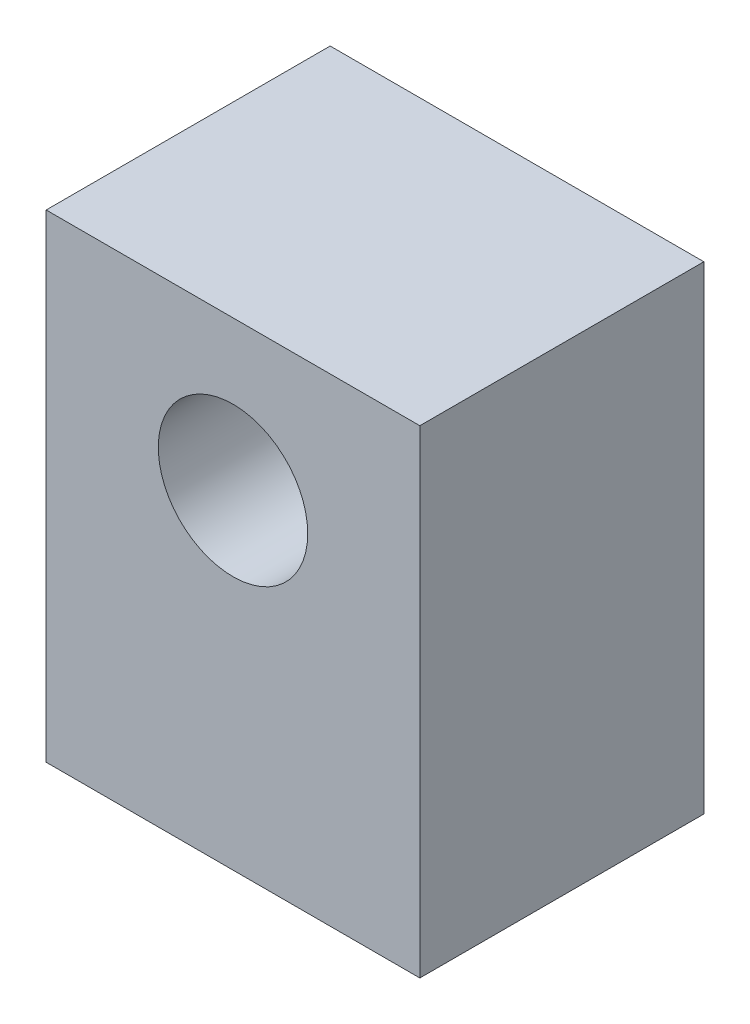
ISO-10303-21;
HEADER;
FILE_DESCRIPTION(('STEP AP214'),'2;1');
FILE_NAME('part.step','',(''),(''),'','','');
FILE_SCHEMA(('AUTOMOTIVE_DESIGN { 1 0 10303 214 1 1 1 1 }'));
ENDSEC;
DATA;
#1=APPLICATION_CONTEXT('core data for automotive mechanical design processes');
#2=APPLICATION_PROTOCOL_DEFINITION('international standard','automotive_design',2000,#1);
#3=PRODUCT_CONTEXT('',#1,'mechanical');
#4=PRODUCT('Part','Part','',(#3));
#5=PRODUCT_RELATED_PRODUCT_CATEGORY('part','',(#4));
#6=PRODUCT_DEFINITION_FORMATION('','',#4);
#7=PRODUCT_DEFINITION_CONTEXT('part definition',#1,'design');
#8=PRODUCT_DEFINITION('design','',#6,#7);
#9=PRODUCT_DEFINITION_SHAPE('','',#8);
#10=(LENGTH_UNIT() NAMED_UNIT(*) SI_UNIT(.MILLI.,.METRE.));
#11=(NAMED_UNIT(*) PLANE_ANGLE_UNIT() SI_UNIT($,.RADIAN.));
#12=(NAMED_UNIT(*) SI_UNIT($,.STERADIAN.) SOLID_ANGLE_UNIT());
#13=UNCERTAINTY_MEASURE_WITH_UNIT(LENGTH_MEASURE(1.E-05),#10,'distance_accuracy_value','');
#14=(GEOMETRIC_REPRESENTATION_CONTEXT(3) GLOBAL_UNCERTAINTY_ASSIGNED_CONTEXT((#13)) GLOBAL_UNIT_ASSIGNED_CONTEXT((#10,
#11,#12)) REPRESENTATION_CONTEXT('',''));
#15=CARTESIAN_POINT('',(0.,0.,0.));
#16=DIRECTION('',(0.,0.,1.));
#17=DIRECTION('',(1.,0.,0.));
#18=AXIS2_PLACEMENT_3D('',#15,#16,#17);
#19=CARTESIAN_POINT('',(6.25,-8.,9.5));
#20=DIRECTION('',(-1.,0.,0.));
#21=DIRECTION('',(0.,0.,1.));
#22=AXIS2_PLACEMENT_3D('',#19,#20,#21);
#23=PLANE('',#22);
#24=DIRECTION('',(0.,1.,0.));
#25=VECTOR('',#24,1.);
#26=CARTESIAN_POINT('',(6.25,-8.,0.));
#27=LINE('',#26,#25);
#28=CARTESIAN_POINT('',(6.25,-8.,0.));
#29=VERTEX_POINT('',#28);
#30=CARTESIAN_POINT('',(6.25,8.,0.));
#31=VERTEX_POINT('',#30);
#32=EDGE_CURVE('E107',#29,#31,#27,.T.);
#33=ORIENTED_EDGE('',*,*,#32,.T.);
#34=DIRECTION('',(0.,0.,-1.));
#35=VECTOR('',#34,1.);
#36=CARTESIAN_POINT('',(6.25,8.,9.5));
#37=LINE('',#36,#35);
#38=CARTESIAN_POINT('',(6.25,8.,9.5));
#39=VERTEX_POINT('',#38);
#40=EDGE_CURVE('E11',#39,#31,#37,.T.);
#41=ORIENTED_EDGE('',*,*,#40,.F.);
#42=DIRECTION('',(0.,1.,0.));
#43=VECTOR('',#42,1.);
#44=CARTESIAN_POINT('',(6.25,-8.,9.5));
#45=LINE('',#44,#43);
#46=CARTESIAN_POINT('',(6.25,-8.,9.5));
#47=VERTEX_POINT('',#46);
#48=EDGE_CURVE('E91',#47,#39,#45,.T.);
#49=ORIENTED_EDGE('',*,*,#48,.F.);
#50=DIRECTION('',(0.,0.,-1.));
#51=VECTOR('',#50,1.);
#52=CARTESIAN_POINT('',(6.25,-8.,9.5));
#53=LINE('',#52,#51);
#54=EDGE_CURVE('E103',#47,#29,#53,.T.);
#55=ORIENTED_EDGE('',*,*,#54,.T.);
#56=EDGE_LOOP('',(#33,#41,#49,#55));
#57=FACE_BOUND('',#56,.T.);
#58=ADVANCED_FACE('F39',(#57),#23,.F.);
#59=CARTESIAN_POINT('',(-6.25,8.,9.5));
#60=DIRECTION('',(0.,-1.,0.));
#61=DIRECTION('',(0.,0.,-1.));
#62=AXIS2_PLACEMENT_3D('',#59,#60,#61);
#63=PLANE('',#62);
#64=DIRECTION('',(-1.,0.,0.));
#65=VECTOR('',#64,1.);
#66=CARTESIAN_POINT('',(-6.25,8.,0.));
#67=LINE('',#66,#65);
#68=CARTESIAN_POINT('',(-6.25,8.,0.));
#69=VERTEX_POINT('',#68);
#70=EDGE_CURVE('E96',#31,#69,#67,.T.);
#71=ORIENTED_EDGE('',*,*,#70,.T.);
#72=DIRECTION('',(0.,0.,-1.));
#73=VECTOR('',#72,1.);
#74=CARTESIAN_POINT('',(-6.25,8.,9.5));
#75=LINE('',#74,#73);
#76=CARTESIAN_POINT('',(-6.25,8.,9.5));
#77=VERTEX_POINT('',#76);
#78=EDGE_CURVE('E48',#77,#69,#75,.T.);
#79=ORIENTED_EDGE('',*,*,#78,.F.);
#80=DIRECTION('',(-1.,0.,0.));
#81=VECTOR('',#80,1.);
#82=CARTESIAN_POINT('',(-6.25,8.,9.5));
#83=LINE('',#82,#81);
#84=EDGE_CURVE('E86',#39,#77,#83,.T.);
#85=ORIENTED_EDGE('',*,*,#84,.F.);
#86=ORIENTED_EDGE('',*,*,#40,.T.);
#87=EDGE_LOOP('',(#71,#79,#85,#86));
#88=FACE_BOUND('',#87,.T.);
#89=ADVANCED_FACE('F95',(#88),#63,.F.);
#90=CARTESIAN_POINT('',(-6.25,-8.,9.5));
#91=DIRECTION('',(1.,0.,0.));
#92=DIRECTION('',(0.,0.,-1.));
#93=AXIS2_PLACEMENT_3D('',#90,#91,#92);
#94=PLANE('',#93);
#95=DIRECTION('',(0.,-1.,0.));
#96=VECTOR('',#95,1.);
#97=CARTESIAN_POINT('',(-6.25,-8.,0.));
#98=LINE('',#97,#96);
#99=CARTESIAN_POINT('',(-6.25,-8.,0.));
#100=VERTEX_POINT('',#99);
#101=EDGE_CURVE('E73',#69,#100,#98,.T.);
#102=ORIENTED_EDGE('',*,*,#101,.T.);
#103=DIRECTION('',(0.,0.,-1.));
#104=VECTOR('',#103,1.);
#105=CARTESIAN_POINT('',(-6.25,-8.,9.5));
#106=LINE('',#105,#104);
#107=CARTESIAN_POINT('',(-6.25,-8.,9.5));
#108=VERTEX_POINT('',#107);
#109=EDGE_CURVE('E98',#108,#100,#106,.T.);
#110=ORIENTED_EDGE('',*,*,#109,.F.);
#111=DIRECTION('',(0.,-1.,0.));
#112=VECTOR('',#111,1.);
#113=CARTESIAN_POINT('',(-6.25,-8.,9.5));
#114=LINE('',#113,#112);
#115=EDGE_CURVE('E89',#77,#108,#114,.T.);
#116=ORIENTED_EDGE('',*,*,#115,.F.);
#117=ORIENTED_EDGE('',*,*,#78,.T.);
#118=EDGE_LOOP('',(#102,#110,#116,#117));
#119=FACE_BOUND('',#118,.T.);
#120=ADVANCED_FACE('F99',(#119),#94,.F.);
#121=CARTESIAN_POINT('',(-6.25,-8.,9.5));
#122=DIRECTION('',(0.,1.,0.));
#123=DIRECTION('',(0.,0.,1.));
#124=AXIS2_PLACEMENT_3D('',#121,#122,#123);
#125=PLANE('',#124);
#126=DIRECTION('',(1.,0.,0.));
#127=VECTOR('',#126,1.);
#128=CARTESIAN_POINT('',(-6.25,-8.,0.));
#129=LINE('',#128,#127);
#130=EDGE_CURVE('E79',#100,#29,#129,.T.);
#131=ORIENTED_EDGE('',*,*,#130,.T.);
#132=ORIENTED_EDGE('',*,*,#54,.F.);
#133=DIRECTION('',(1.,0.,0.));
#134=VECTOR('',#133,1.);
#135=CARTESIAN_POINT('',(-6.25,-8.,9.5));
#136=LINE('',#135,#134);
#137=EDGE_CURVE('E56',#108,#47,#136,.T.);
#138=ORIENTED_EDGE('',*,*,#137,.F.);
#139=ORIENTED_EDGE('',*,*,#109,.T.);
#140=EDGE_LOOP('',(#131,#132,#138,#139));
#141=FACE_BOUND('',#140,.T.);
#142=ADVANCED_FACE('F121',(#141),#125,.F.);
#143=CARTESIAN_POINT('',(0.,0.,9.5));
#144=DIRECTION('',(0.,0.,-1.));
#145=DIRECTION('',(-1.,0.,0.));
#146=AXIS2_PLACEMENT_3D('',#143,#144,#145);
#147=PLANE('',#146);
#148=CARTESIAN_POINT('',(0.,3.,9.5));
#149=DIRECTION('',(0.,0.,1.));
#150=DIRECTION('',(1.,0.,0.));
#151=AXIS2_PLACEMENT_3D('',#148,#149,#150);
#152=CIRCLE('',#151,2.5);
#153=CARTESIAN_POINT('',(2.5,3.,9.5));
#154=VERTEX_POINT('',#153);
#155=EDGE_CURVE('E128',#154,#154,#152,.T.);
#156=ORIENTED_EDGE('',*,*,#155,.F.);
#157=EDGE_LOOP('',(#156));
#158=FACE_BOUND('',#157,.T.);
#159=ORIENTED_EDGE('',*,*,#48,.T.);
#160=ORIENTED_EDGE('',*,*,#84,.T.);
#161=ORIENTED_EDGE('',*,*,#115,.T.);
#162=ORIENTED_EDGE('',*,*,#137,.T.);
#163=EDGE_LOOP('',(#159,#160,#161,#162));
#164=FACE_BOUND('',#163,.T.);
#165=ADVANCED_FACE('F87',(#158,#164),#147,.F.);
#166=CARTESIAN_POINT('',(0.,0.,0.));
#167=DIRECTION('',(0.,0.,-1.));
#168=DIRECTION('',(-1.,0.,0.));
#169=AXIS2_PLACEMENT_3D('',#166,#167,#168);
#170=PLANE('',#169);
#171=CARTESIAN_POINT('',(0.,3.,0.));
#172=DIRECTION('',(0.,0.,1.));
#173=DIRECTION('',(1.,0.,0.));
#174=AXIS2_PLACEMENT_3D('',#171,#172,#173);
#175=CIRCLE('',#174,2.5);
#176=CARTESIAN_POINT('',(2.5,3.,0.));
#177=VERTEX_POINT('',#176);
#178=EDGE_CURVE('E111',#177,#177,#175,.T.);
#179=ORIENTED_EDGE('',*,*,#178,.T.);
#180=EDGE_LOOP('',(#179));
#181=FACE_BOUND('',#180,.T.);
#182=ORIENTED_EDGE('',*,*,#32,.F.);
#183=ORIENTED_EDGE('',*,*,#130,.F.);
#184=ORIENTED_EDGE('',*,*,#101,.F.);
#185=ORIENTED_EDGE('',*,*,#70,.F.);
#186=EDGE_LOOP('',(#182,#183,#184,#185));
#187=FACE_BOUND('',#186,.T.);
#188=ADVANCED_FACE('F124',(#181,#187),#170,.T.);
#189=CARTESIAN_POINT('',(0.,3.,0.));
#190=DIRECTION('',(0.,0.,1.));
#191=DIRECTION('',(1.,0.,0.));
#192=AXIS2_PLACEMENT_3D('',#189,#190,#191);
#193=CYLINDRICAL_SURFACE('',#192,2.5);
#194=ORIENTED_EDGE('',*,*,#178,.F.);
#195=EDGE_LOOP('',(#194));
#196=FACE_BOUND('',#195,.T.);
#197=ORIENTED_EDGE('',*,*,#155,.T.);
#198=EDGE_LOOP('',(#197));
#199=FACE_BOUND('',#198,.T.);
#200=ADVANCED_FACE('F137',(#196,#199),#193,.F.);
#201=CLOSED_SHELL('',(#58,#89,#120,#142,#165,#188,#200));
#202=MANIFOLD_SOLID_BREP('B2',#201);
#203=ADVANCED_BREP_SHAPE_REPRESENTATION('',(#18,#202),#14);
#204=SHAPE_DEFINITION_REPRESENTATION(#9,#203);
ENDSEC;
END-ISO-10303-21;
